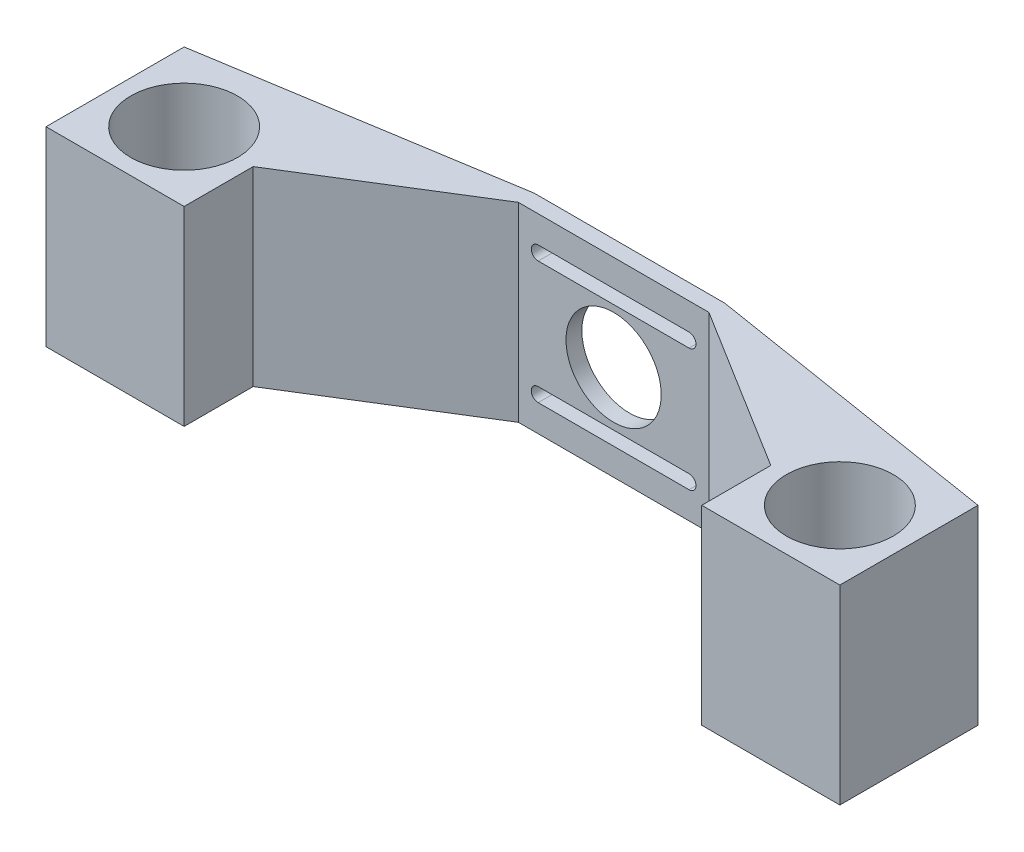
ISO-10303-21;
HEADER;
FILE_DESCRIPTION(('STEP AP214'),'2;1');
FILE_NAME('part.step','',(''),(''),'','','');
FILE_SCHEMA(('AUTOMOTIVE_DESIGN { 1 0 10303 214 1 1 1 1 }'));
ENDSEC;
DATA;
#1=APPLICATION_CONTEXT('core data for automotive mechanical design processes');
#2=APPLICATION_PROTOCOL_DEFINITION('international standard','automotive_design',2000,#1);
#3=PRODUCT_CONTEXT('',#1,'mechanical');
#4=PRODUCT('Part','Part','',(#3));
#5=PRODUCT_RELATED_PRODUCT_CATEGORY('part','',(#4));
#6=PRODUCT_DEFINITION_FORMATION('','',#4);
#7=PRODUCT_DEFINITION_CONTEXT('part definition',#1,'design');
#8=PRODUCT_DEFINITION('design','',#6,#7);
#9=PRODUCT_DEFINITION_SHAPE('','',#8);
#10=(LENGTH_UNIT() NAMED_UNIT(*) SI_UNIT(.MILLI.,.METRE.));
#11=(NAMED_UNIT(*) PLANE_ANGLE_UNIT() SI_UNIT($,.RADIAN.));
#12=(NAMED_UNIT(*) SI_UNIT($,.STERADIAN.) SOLID_ANGLE_UNIT());
#13=UNCERTAINTY_MEASURE_WITH_UNIT(LENGTH_MEASURE(1.E-05),#10,'distance_accuracy_value','');
#14=(GEOMETRIC_REPRESENTATION_CONTEXT(3) GLOBAL_UNCERTAINTY_ASSIGNED_CONTEXT((#13)) GLOBAL_UNIT_ASSIGNED_CONTEXT((#10,
#11,#12)) REPRESENTATION_CONTEXT('',''));
#15=CARTESIAN_POINT('',(0.,0.,0.));
#16=DIRECTION('',(0.,0.,1.));
#17=DIRECTION('',(1.,0.,0.));
#18=AXIS2_PLACEMENT_3D('',#15,#16,#17);
#19=CARTESIAN_POINT('',(0.,48.,0.));
#20=DIRECTION('',(0.,1.,0.));
#21=DIRECTION('',(0.,0.,1.));
#22=AXIS2_PLACEMENT_3D('',#19,#20,#21);
#23=PLANE('',#22);
#24=DIRECTION('',(0.,0.,1.));
#25=VECTOR('',#24,1.);
#26=CARTESIAN_POINT('',(-17.4,48.,17.4));
#27=LINE('',#26,#25);
#28=CARTESIAN_POINT('',(-17.4,48.,-17.4));
#29=VERTEX_POINT('',#28);
#30=CARTESIAN_POINT('',(-17.4,48.,17.4));
#31=VERTEX_POINT('',#30);
#32=EDGE_CURVE('E303',#29,#31,#27,.T.);
#33=ORIENTED_EDGE('',*,*,#32,.T.);
#34=DIRECTION('',(1.,0.,0.));
#35=VECTOR('',#34,1.);
#36=CARTESIAN_POINT('',(-17.4,48.,17.4));
#37=LINE('',#36,#35);
#38=CARTESIAN_POINT('',(17.4,48.,17.4));
#39=VERTEX_POINT('',#38);
#40=EDGE_CURVE('E306',#31,#39,#37,.T.);
#41=ORIENTED_EDGE('',*,*,#40,.T.);
#42=DIRECTION('',(0.,0.,-1.));
#43=VECTOR('',#42,1.);
#44=CARTESIAN_POINT('',(17.4,48.,17.4));
#45=LINE('',#44,#43);
#46=CARTESIAN_POINT('',(17.4,48.,0.));
#47=VERTEX_POINT('',#46);
#48=EDGE_CURVE('E309',#39,#47,#45,.T.);
#49=ORIENTED_EDGE('',*,*,#48,.T.);
#50=DIRECTION('',(0.849385240816697,0.,-0.527773353517171));
#51=VECTOR('',#50,1.);
#52=CARTESIAN_POINT('',(17.4,48.,0.));
#53=LINE('',#52,#51);
#54=CARTESIAN_POINT('',(58.6,48.,-25.6));
#55=VERTEX_POINT('',#54);
#56=EDGE_CURVE('E311',#47,#55,#53,.T.);
#57=ORIENTED_EDGE('',*,*,#56,.T.);
#58=DIRECTION('',(1.,0.,0.));
#59=VECTOR('',#58,1.);
#60=CARTESIAN_POINT('',(82.6,48.,-25.6));
#61=LINE('',#60,#59);
#62=CARTESIAN_POINT('',(106.6,48.,-25.6));
#63=VERTEX_POINT('',#62);
#64=EDGE_CURVE('E313',#55,#63,#61,.T.);
#65=ORIENTED_EDGE('',*,*,#64,.T.);
#66=DIRECTION('',(-0.849385240816697,0.,-0.527773353517171));
#67=VECTOR('',#66,1.);
#68=CARTESIAN_POINT('',(147.8,48.,0.));
#69=LINE('',#68,#67);
#70=CARTESIAN_POINT('',(147.8,48.,0.));
#71=VERTEX_POINT('',#70);
#72=EDGE_CURVE('E260',#71,#63,#69,.T.);
#73=ORIENTED_EDGE('',*,*,#72,.F.);
#74=DIRECTION('',(0.,0.,-1.));
#75=VECTOR('',#74,1.);
#76=CARTESIAN_POINT('',(147.8,48.,17.4));
#77=LINE('',#76,#75);
#78=CARTESIAN_POINT('',(147.8,48.,17.4));
#79=VERTEX_POINT('',#78);
#80=EDGE_CURVE('E263',#79,#71,#77,.T.);
#81=ORIENTED_EDGE('',*,*,#80,.F.);
#82=DIRECTION('',(-1.,0.,0.));
#83=VECTOR('',#82,1.);
#84=CARTESIAN_POINT('',(182.6,48.,17.4));
#85=LINE('',#84,#83);
#86=CARTESIAN_POINT('',(182.6,48.,17.4));
#87=VERTEX_POINT('',#86);
#88=EDGE_CURVE('E266',#87,#79,#85,.T.);
#89=ORIENTED_EDGE('',*,*,#88,.F.);
#90=DIRECTION('',(0.,0.,1.));
#91=VECTOR('',#90,1.);
#92=CARTESIAN_POINT('',(182.6,48.,17.4));
#93=LINE('',#92,#91);
#94=CARTESIAN_POINT('',(182.6,48.,-17.4));
#95=VERTEX_POINT('',#94);
#96=EDGE_CURVE('E253',#95,#87,#93,.T.);
#97=ORIENTED_EDGE('',*,*,#96,.F.);
#98=DIRECTION('',(0.98735943126704,0.,0.158497171861288));
#99=VECTOR('',#98,1.);
#100=CARTESIAN_POINT('',(106.6,48.,-29.6));
#101=LINE('',#100,#99);
#102=CARTESIAN_POINT('',(106.6,48.,-29.6));
#103=VERTEX_POINT('',#102);
#104=EDGE_CURVE('E256',#103,#95,#101,.T.);
#105=ORIENTED_EDGE('',*,*,#104,.F.);
#106=DIRECTION('',(-1.,0.,0.));
#107=VECTOR('',#106,1.);
#108=CARTESIAN_POINT('',(82.6,48.,-29.6));
#109=LINE('',#108,#107);
#110=CARTESIAN_POINT('',(58.6,48.,-29.6));
#111=VERTEX_POINT('',#110);
#112=EDGE_CURVE('E315',#103,#111,#109,.T.);
#113=ORIENTED_EDGE('',*,*,#112,.T.);
#114=DIRECTION('',(-0.98735943126704,0.,0.158497171861288));
#115=VECTOR('',#114,1.);
#116=CARTESIAN_POINT('',(58.6,48.,-29.6));
#117=LINE('',#116,#115);
#118=EDGE_CURVE('E317',#111,#29,#117,.T.);
#119=ORIENTED_EDGE('',*,*,#118,.T.);
#120=EDGE_LOOP('',(#33,#41,#49,#57,#65,#73,#81,#89,#97,#105,#113,#119));
#121=FACE_BOUND('',#120,.T.);
#122=CARTESIAN_POINT('',(0.,48.,0.));
#123=DIRECTION('',(0.,1.,0.));
#124=DIRECTION('',(0.,0.,1.));
#125=AXIS2_PLACEMENT_3D('',#122,#123,#124);
#126=CIRCLE('',#125,13.45);
#127=CARTESIAN_POINT('',(0.,48.,13.45));
#128=VERTEX_POINT('',#127);
#129=EDGE_CURVE('E297',#128,#128,#126,.T.);
#130=ORIENTED_EDGE('',*,*,#129,.F.);
#131=EDGE_LOOP('',(#130));
#132=FACE_BOUND('',#131,.T.);
#133=CARTESIAN_POINT('',(165.2,48.,0.));
#134=DIRECTION('',(0.,-1.,0.));
#135=DIRECTION('',(0.,0.,1.));
#136=AXIS2_PLACEMENT_3D('',#133,#134,#135);
#137=CIRCLE('',#136,13.45);
#138=CARTESIAN_POINT('',(165.2,48.,13.45));
#139=VERTEX_POINT('',#138);
#140=EDGE_CURVE('E247',#139,#139,#137,.T.);
#141=ORIENTED_EDGE('',*,*,#140,.T.);
#142=EDGE_LOOP('',(#141));
#143=FACE_BOUND('',#142,.T.);
#144=ADVANCED_FACE('F33',(#121,#132,#143),#23,.T.);
#145=CARTESIAN_POINT('',(0.,0.,0.));
#146=DIRECTION('',(0.,1.,0.));
#147=DIRECTION('',(0.,0.,1.));
#148=AXIS2_PLACEMENT_3D('',#145,#146,#147);
#149=PLANE('',#148);
#150=DIRECTION('',(0.,0.,1.));
#151=VECTOR('',#150,1.);
#152=CARTESIAN_POINT('',(-17.4,0.,17.4));
#153=LINE('',#152,#151);
#154=CARTESIAN_POINT('',(-17.4,0.,-17.4));
#155=VERTEX_POINT('',#154);
#156=CARTESIAN_POINT('',(-17.4,0.,17.4));
#157=VERTEX_POINT('',#156);
#158=EDGE_CURVE('E300',#155,#157,#153,.T.);
#159=ORIENTED_EDGE('',*,*,#158,.F.);
#160=DIRECTION('',(-0.98735943126704,0.,0.158497171861288));
#161=VECTOR('',#160,1.);
#162=CARTESIAN_POINT('',(58.6,0.,-29.6));
#163=LINE('',#162,#161);
#164=CARTESIAN_POINT('',(58.6,0.,-29.6));
#165=VERTEX_POINT('',#164);
#166=EDGE_CURVE('E307',#165,#155,#163,.T.);
#167=ORIENTED_EDGE('',*,*,#166,.F.);
#168=DIRECTION('',(-1.,0.,0.));
#169=VECTOR('',#168,1.);
#170=CARTESIAN_POINT('',(82.6,0.,-29.6));
#171=LINE('',#170,#169);
#172=CARTESIAN_POINT('',(106.6,0.,-29.6));
#173=VERTEX_POINT('',#172);
#174=EDGE_CURVE('E330',#173,#165,#171,.T.);
#175=ORIENTED_EDGE('',*,*,#174,.F.);
#176=DIRECTION('',(0.98735943126704,0.,0.158497171861288));
#177=VECTOR('',#176,1.);
#178=CARTESIAN_POINT('',(106.6,0.,-29.6));
#179=LINE('',#178,#177);
#180=CARTESIAN_POINT('',(182.6,0.,-17.4));
#181=VERTEX_POINT('',#180);
#182=EDGE_CURVE('E272',#173,#181,#179,.T.);
#183=ORIENTED_EDGE('',*,*,#182,.T.);
#184=DIRECTION('',(0.,0.,1.));
#185=VECTOR('',#184,1.);
#186=CARTESIAN_POINT('',(182.6,0.,17.4));
#187=LINE('',#186,#185);
#188=CARTESIAN_POINT('',(182.6,0.,17.4));
#189=VERTEX_POINT('',#188);
#190=EDGE_CURVE('E250',#181,#189,#187,.T.);
#191=ORIENTED_EDGE('',*,*,#190,.T.);
#192=DIRECTION('',(-1.,0.,0.));
#193=VECTOR('',#192,1.);
#194=CARTESIAN_POINT('',(182.6,0.,17.4));
#195=LINE('',#194,#193);
#196=CARTESIAN_POINT('',(147.8,0.,17.4));
#197=VERTEX_POINT('',#196);
#198=EDGE_CURVE('E257',#189,#197,#195,.T.);
#199=ORIENTED_EDGE('',*,*,#198,.T.);
#200=DIRECTION('',(0.,0.,-1.));
#201=VECTOR('',#200,1.);
#202=CARTESIAN_POINT('',(147.8,0.,17.4));
#203=LINE('',#202,#201);
#204=CARTESIAN_POINT('',(147.8,0.,0.));
#205=VERTEX_POINT('',#204);
#206=EDGE_CURVE('E278',#197,#205,#203,.T.);
#207=ORIENTED_EDGE('',*,*,#206,.T.);
#208=DIRECTION('',(-0.849385240816697,0.,-0.527773353517171));
#209=VECTOR('',#208,1.);
#210=CARTESIAN_POINT('',(147.8,0.,0.));
#211=LINE('',#210,#209);
#212=CARTESIAN_POINT('',(106.6,0.,-25.6));
#213=VERTEX_POINT('',#212);
#214=EDGE_CURVE('E275',#205,#213,#211,.T.);
#215=ORIENTED_EDGE('',*,*,#214,.T.);
#216=DIRECTION('',(1.,0.,0.));
#217=VECTOR('',#216,1.);
#218=CARTESIAN_POINT('',(82.6,0.,-25.6));
#219=LINE('',#218,#217);
#220=CARTESIAN_POINT('',(58.6,0.,-25.6));
#221=VERTEX_POINT('',#220);
#222=EDGE_CURVE('E328',#221,#213,#219,.T.);
#223=ORIENTED_EDGE('',*,*,#222,.F.);
#224=DIRECTION('',(0.849385240816697,0.,-0.527773353517171));
#225=VECTOR('',#224,1.);
#226=CARTESIAN_POINT('',(17.4,0.,0.));
#227=LINE('',#226,#225);
#228=CARTESIAN_POINT('',(17.4,0.,0.));
#229=VERTEX_POINT('',#228);
#230=EDGE_CURVE('E326',#229,#221,#227,.T.);
#231=ORIENTED_EDGE('',*,*,#230,.F.);
#232=DIRECTION('',(0.,0.,-1.));
#233=VECTOR('',#232,1.);
#234=CARTESIAN_POINT('',(17.4,0.,17.4));
#235=LINE('',#234,#233);
#236=CARTESIAN_POINT('',(17.4,0.,17.4));
#237=VERTEX_POINT('',#236);
#238=EDGE_CURVE('E324',#237,#229,#235,.T.);
#239=ORIENTED_EDGE('',*,*,#238,.F.);
#240=DIRECTION('',(1.,0.,0.));
#241=VECTOR('',#240,1.);
#242=CARTESIAN_POINT('',(-17.4,0.,17.4));
#243=LINE('',#242,#241);
#244=EDGE_CURVE('E322',#157,#237,#243,.T.);
#245=ORIENTED_EDGE('',*,*,#244,.F.);
#246=EDGE_LOOP('',(#159,#167,#175,#183,#191,#199,#207,#215,#223,#231,#239,#245));
#247=FACE_BOUND('',#246,.T.);
#248=CARTESIAN_POINT('',(0.,0.,0.));
#249=DIRECTION('',(0.,1.,0.));
#250=DIRECTION('',(0.,0.,1.));
#251=AXIS2_PLACEMENT_3D('',#248,#249,#250);
#252=CIRCLE('',#251,13.45);
#253=CARTESIAN_POINT('',(0.,0.,13.45));
#254=VERTEX_POINT('',#253);
#255=EDGE_CURVE('E296',#254,#254,#252,.T.);
#256=ORIENTED_EDGE('',*,*,#255,.T.);
#257=EDGE_LOOP('',(#256));
#258=FACE_BOUND('',#257,.T.);
#259=CARTESIAN_POINT('',(165.2,0.,0.));
#260=DIRECTION('',(0.,-1.,0.));
#261=DIRECTION('',(0.,0.,1.));
#262=AXIS2_PLACEMENT_3D('',#259,#260,#261);
#263=CIRCLE('',#262,13.45);
#264=CARTESIAN_POINT('',(165.2,0.,13.45));
#265=VERTEX_POINT('',#264);
#266=EDGE_CURVE('E246',#265,#265,#263,.T.);
#267=ORIENTED_EDGE('',*,*,#266,.F.);
#268=EDGE_LOOP('',(#267));
#269=FACE_BOUND('',#268,.T.);
#270=ADVANCED_FACE('F354',(#247,#258,#269),#149,.F.);
#271=CARTESIAN_POINT('',(-17.4,48.,17.4));
#272=DIRECTION('',(1.,0.,0.));
#273=DIRECTION('',(0.,0.,-1.));
#274=AXIS2_PLACEMENT_3D('',#271,#272,#273);
#275=PLANE('',#274);
#276=ORIENTED_EDGE('',*,*,#158,.T.);
#277=DIRECTION('',(0.,-1.,0.));
#278=VECTOR('',#277,1.);
#279=CARTESIAN_POINT('',(-17.4,48.,17.4));
#280=LINE('',#279,#278);
#281=EDGE_CURVE('E11',#31,#157,#280,.T.);
#282=ORIENTED_EDGE('',*,*,#281,.F.);
#283=ORIENTED_EDGE('',*,*,#32,.F.);
#284=DIRECTION('',(0.,-1.,0.));
#285=VECTOR('',#284,1.);
#286=CARTESIAN_POINT('',(-17.4,48.,-17.4));
#287=LINE('',#286,#285);
#288=EDGE_CURVE('E319',#29,#155,#287,.T.);
#289=ORIENTED_EDGE('',*,*,#288,.T.);
#290=EDGE_LOOP('',(#276,#282,#283,#289));
#291=FACE_BOUND('',#290,.T.);
#292=ADVANCED_FACE('F35',(#291),#275,.F.);
#293=CARTESIAN_POINT('',(-17.4,48.,17.4));
#294=DIRECTION('',(0.,0.,-1.));
#295=DIRECTION('',(-1.,0.,0.));
#296=AXIS2_PLACEMENT_3D('',#293,#294,#295);
#297=PLANE('',#296);
#298=ORIENTED_EDGE('',*,*,#244,.T.);
#299=DIRECTION('',(0.,-1.,0.));
#300=VECTOR('',#299,1.);
#301=CARTESIAN_POINT('',(17.4,48.,17.4));
#302=LINE('',#301,#300);
#303=EDGE_CURVE('E41',#39,#237,#302,.T.);
#304=ORIENTED_EDGE('',*,*,#303,.F.);
#305=ORIENTED_EDGE('',*,*,#40,.F.);
#306=ORIENTED_EDGE('',*,*,#281,.T.);
#307=EDGE_LOOP('',(#298,#304,#305,#306));
#308=FACE_BOUND('',#307,.T.);
#309=ADVANCED_FACE('F371',(#308),#297,.F.);
#310=CARTESIAN_POINT('',(17.4,48.,17.4));
#311=DIRECTION('',(-1.,0.,0.));
#312=DIRECTION('',(0.,0.,1.));
#313=AXIS2_PLACEMENT_3D('',#310,#311,#312);
#314=PLANE('',#313);
#315=ORIENTED_EDGE('',*,*,#238,.T.);
#316=DIRECTION('',(0.,-1.,0.));
#317=VECTOR('',#316,1.);
#318=CARTESIAN_POINT('',(17.4,48.,0.));
#319=LINE('',#318,#317);
#320=EDGE_CURVE('E341',#47,#229,#319,.T.);
#321=ORIENTED_EDGE('',*,*,#320,.F.);
#322=ORIENTED_EDGE('',*,*,#48,.F.);
#323=ORIENTED_EDGE('',*,*,#303,.T.);
#324=EDGE_LOOP('',(#315,#321,#322,#323));
#325=FACE_BOUND('',#324,.T.);
#326=ADVANCED_FACE('F348',(#325),#314,.F.);
#327=CARTESIAN_POINT('',(17.4,48.,0.));
#328=DIRECTION('',(-0.527773353517171,0.,-0.849385240816697));
#329=DIRECTION('',(-0.849385240816697,0.,0.527773353517171));
#330=AXIS2_PLACEMENT_3D('',#327,#328,#329);
#331=PLANE('',#330);
#332=ORIENTED_EDGE('',*,*,#230,.T.);
#333=DIRECTION('',(0.,-1.,0.));
#334=VECTOR('',#333,1.);
#335=CARTESIAN_POINT('',(58.6,48.,-25.6));
#336=LINE('',#335,#334);
#337=EDGE_CURVE('E338',#55,#221,#336,.T.);
#338=ORIENTED_EDGE('',*,*,#337,.F.);
#339=ORIENTED_EDGE('',*,*,#56,.F.);
#340=ORIENTED_EDGE('',*,*,#320,.T.);
#341=EDGE_LOOP('',(#332,#338,#339,#340));
#342=FACE_BOUND('',#341,.T.);
#343=ADVANCED_FACE('F359',(#342),#331,.F.);
#344=CARTESIAN_POINT('',(82.6,48.,-25.6));
#345=DIRECTION('',(0.,0.,-1.));
#346=DIRECTION('',(-1.,0.,0.));
#347=AXIS2_PLACEMENT_3D('',#344,#345,#346);
#348=PLANE('',#347);
#349=DIRECTION('',(1.,0.,0.));
#350=VECTOR('',#349,1.);
#351=CARTESIAN_POINT('',(82.6,10.3,-25.6));
#352=LINE('',#351,#350);
#353=CARTESIAN_POINT('',(63.6,10.3,-25.6));
#354=VERTEX_POINT('',#353);
#355=CARTESIAN_POINT('',(101.6,10.3,-25.6));
#356=VERTEX_POINT('',#355);
#357=EDGE_CURVE('E240',#354,#356,#352,.T.);
#358=ORIENTED_EDGE('',*,*,#357,.T.);
#359=CARTESIAN_POINT('',(101.6,8.55,-25.6));
#360=DIRECTION('',(0.,0.,-1.));
#361=DIRECTION('',(-1.,0.,0.));
#362=AXIS2_PLACEMENT_3D('',#359,#360,#361);
#363=CIRCLE('',#362,1.75);
#364=CARTESIAN_POINT('',(101.6,6.8,-25.6));
#365=VERTEX_POINT('',#364);
#366=EDGE_CURVE('E243',#356,#365,#363,.T.);
#367=ORIENTED_EDGE('',*,*,#366,.T.);
#368=DIRECTION('',(-1.,0.,0.));
#369=VECTOR('',#368,1.);
#370=CARTESIAN_POINT('',(82.6,6.80000000000001,-25.6));
#371=LINE('',#370,#369);
#372=CARTESIAN_POINT('',(63.6,6.80000000000001,-25.6));
#373=VERTEX_POINT('',#372);
#374=EDGE_CURVE('E237',#365,#373,#371,.T.);
#375=ORIENTED_EDGE('',*,*,#374,.T.);
#376=CARTESIAN_POINT('',(63.6,8.55000000000001,-25.6));
#377=DIRECTION('',(0.,0.,-1.));
#378=DIRECTION('',(-1.,0.,0.));
#379=AXIS2_PLACEMENT_3D('',#376,#377,#378);
#380=CIRCLE('',#379,1.75);
#381=EDGE_CURVE('E175',#373,#354,#380,.T.);
#382=ORIENTED_EDGE('',*,*,#381,.T.);
#383=EDGE_LOOP('',(#358,#367,#375,#382));
#384=FACE_BOUND('',#383,.T.);
#385=DIRECTION('',(1.,0.,0.));
#386=VECTOR('',#385,1.);
#387=CARTESIAN_POINT('',(82.6,41.2,-25.6));
#388=LINE('',#387,#386);
#389=CARTESIAN_POINT('',(63.6,41.2,-25.6));
#390=VERTEX_POINT('',#389);
#391=CARTESIAN_POINT('',(101.6,41.2,-25.6));
#392=VERTEX_POINT('',#391);
#393=EDGE_CURVE('E231',#390,#392,#388,.T.);
#394=ORIENTED_EDGE('',*,*,#393,.T.);
#395=CARTESIAN_POINT('',(101.6,39.45,-25.6));
#396=DIRECTION('',(0.,0.,-1.));
#397=DIRECTION('',(-1.,0.,0.));
#398=AXIS2_PLACEMENT_3D('',#395,#396,#397);
#399=CIRCLE('',#398,1.75);
#400=CARTESIAN_POINT('',(101.6,37.7,-25.6));
#401=VERTEX_POINT('',#400);
#402=EDGE_CURVE('E234',#392,#401,#399,.T.);
#403=ORIENTED_EDGE('',*,*,#402,.T.);
#404=DIRECTION('',(-1.,0.,0.));
#405=VECTOR('',#404,1.);
#406=CARTESIAN_POINT('',(82.6,37.7,-25.6));
#407=LINE('',#406,#405);
#408=CARTESIAN_POINT('',(63.6,37.7,-25.6));
#409=VERTEX_POINT('',#408);
#410=EDGE_CURVE('E225',#401,#409,#407,.T.);
#411=ORIENTED_EDGE('',*,*,#410,.T.);
#412=CARTESIAN_POINT('',(63.6,39.45,-25.6));
#413=DIRECTION('',(0.,0.,-1.));
#414=DIRECTION('',(-1.,0.,0.));
#415=AXIS2_PLACEMENT_3D('',#412,#413,#414);
#416=CIRCLE('',#415,1.75);
#417=EDGE_CURVE('E228',#409,#390,#416,.T.);
#418=ORIENTED_EDGE('',*,*,#417,.T.);
#419=EDGE_LOOP('',(#394,#403,#411,#418));
#420=FACE_BOUND('',#419,.T.);
#421=CARTESIAN_POINT('',(82.6,24.,-25.6));
#422=DIRECTION('',(0.,0.,-1.));
#423=DIRECTION('',(-1.,0.,0.));
#424=AXIS2_PLACEMENT_3D('',#421,#422,#423);
#425=CIRCLE('',#424,12.);
#426=CARTESIAN_POINT('',(70.6,24.,-25.6));
#427=VERTEX_POINT('',#426);
#428=EDGE_CURVE('E199',#427,#427,#425,.T.);
#429=ORIENTED_EDGE('',*,*,#428,.T.);
#430=EDGE_LOOP('',(#429));
#431=FACE_BOUND('',#430,.T.);
#432=ORIENTED_EDGE('',*,*,#222,.T.);
#433=DIRECTION('',(0.,-1.,0.));
#434=VECTOR('',#433,1.);
#435=CARTESIAN_POINT('',(106.6,48.,-25.6));
#436=LINE('',#435,#434);
#437=EDGE_CURVE('E288',#63,#213,#436,.T.);
#438=ORIENTED_EDGE('',*,*,#437,.F.);
#439=ORIENTED_EDGE('',*,*,#64,.F.);
#440=ORIENTED_EDGE('',*,*,#337,.T.);
#441=EDGE_LOOP('',(#432,#438,#439,#440));
#442=FACE_BOUND('',#441,.T.);
#443=ADVANCED_FACE('F363',(#384,#420,#431,#442),#348,.F.);
#444=CARTESIAN_POINT('',(82.6,48.,-29.6));
#445=DIRECTION('',(0.,0.,1.));
#446=DIRECTION('',(1.,0.,0.));
#447=AXIS2_PLACEMENT_3D('',#444,#445,#446);
#448=PLANE('',#447);
#449=DIRECTION('',(-1.,0.,0.));
#450=VECTOR('',#449,1.);
#451=CARTESIAN_POINT('',(101.6,6.8,-29.6));
#452=LINE('',#451,#450);
#453=CARTESIAN_POINT('',(101.6,6.8,-29.6));
#454=VERTEX_POINT('',#453);
#455=CARTESIAN_POINT('',(63.6,6.80000000000001,-29.6));
#456=VERTEX_POINT('',#455);
#457=EDGE_CURVE('E182',#454,#456,#452,.T.);
#458=ORIENTED_EDGE('',*,*,#457,.F.);
#459=CARTESIAN_POINT('',(101.6,8.55,-29.6));
#460=DIRECTION('',(0.,0.,-1.));
#461=DIRECTION('',(-1.,0.,0.));
#462=AXIS2_PLACEMENT_3D('',#459,#460,#461);
#463=CIRCLE('',#462,1.75);
#464=CARTESIAN_POINT('',(101.6,10.3,-29.6));
#465=VERTEX_POINT('',#464);
#466=EDGE_CURVE('E187',#465,#454,#463,.T.);
#467=ORIENTED_EDGE('',*,*,#466,.F.);
#468=DIRECTION('',(1.,0.,0.));
#469=VECTOR('',#468,1.);
#470=CARTESIAN_POINT('',(101.6,10.3,-29.6));
#471=LINE('',#470,#469);
#472=CARTESIAN_POINT('',(63.6,10.3,-29.6));
#473=VERTEX_POINT('',#472);
#474=EDGE_CURVE('E192',#473,#465,#471,.T.);
#475=ORIENTED_EDGE('',*,*,#474,.F.);
#476=CARTESIAN_POINT('',(63.6,8.55000000000001,-29.6));
#477=DIRECTION('',(0.,0.,-1.));
#478=DIRECTION('',(-1.,0.,0.));
#479=AXIS2_PLACEMENT_3D('',#476,#477,#478);
#480=CIRCLE('',#479,1.75);
#481=EDGE_CURVE('E172',#456,#473,#480,.T.);
#482=ORIENTED_EDGE('',*,*,#481,.F.);
#483=EDGE_LOOP('',(#458,#467,#475,#482));
#484=FACE_BOUND('',#483,.T.);
#485=DIRECTION('',(-1.,0.,0.));
#486=VECTOR('',#485,1.);
#487=CARTESIAN_POINT('',(101.6,37.7,-29.6));
#488=LINE('',#487,#486);
#489=CARTESIAN_POINT('',(101.6,37.7,-29.6));
#490=VERTEX_POINT('',#489);
#491=CARTESIAN_POINT('',(63.6,37.7,-29.6));
#492=VERTEX_POINT('',#491);
#493=EDGE_CURVE('E204',#490,#492,#488,.T.);
#494=ORIENTED_EDGE('',*,*,#493,.F.);
#495=CARTESIAN_POINT('',(101.6,39.45,-29.6));
#496=DIRECTION('',(0.,0.,-1.));
#497=DIRECTION('',(1.,0.,0.));
#498=AXIS2_PLACEMENT_3D('',#495,#496,#497);
#499=CIRCLE('',#498,1.75);
#500=CARTESIAN_POINT('',(101.6,41.2,-29.6));
#501=VERTEX_POINT('',#500);
#502=EDGE_CURVE('E202',#501,#490,#499,.T.);
#503=ORIENTED_EDGE('',*,*,#502,.F.);
#504=DIRECTION('',(1.,0.,0.));
#505=VECTOR('',#504,1.);
#506=CARTESIAN_POINT('',(101.6,41.2,-29.6));
#507=LINE('',#506,#505);
#508=CARTESIAN_POINT('',(63.6,41.2,-29.6));
#509=VERTEX_POINT('',#508);
#510=EDGE_CURVE('E210',#509,#501,#507,.T.);
#511=ORIENTED_EDGE('',*,*,#510,.F.);
#512=CARTESIAN_POINT('',(63.6,39.45,-29.6));
#513=DIRECTION('',(0.,0.,-1.));
#514=DIRECTION('',(1.,0.,0.));
#515=AXIS2_PLACEMENT_3D('',#512,#513,#514);
#516=CIRCLE('',#515,1.75);
#517=EDGE_CURVE('E207',#492,#509,#516,.T.);
#518=ORIENTED_EDGE('',*,*,#517,.F.);
#519=EDGE_LOOP('',(#494,#503,#511,#518));
#520=FACE_BOUND('',#519,.T.);
#521=CARTESIAN_POINT('',(82.6,24.,-29.6));
#522=DIRECTION('',(0.,0.,-1.));
#523=DIRECTION('',(-1.,0.,0.));
#524=AXIS2_PLACEMENT_3D('',#521,#522,#523);
#525=CIRCLE('',#524,12.);
#526=CARTESIAN_POINT('',(70.6,24.,-29.6));
#527=VERTEX_POINT('',#526);
#528=EDGE_CURVE('E205',#527,#527,#525,.T.);
#529=ORIENTED_EDGE('',*,*,#528,.F.);
#530=EDGE_LOOP('',(#529));
#531=FACE_BOUND('',#530,.T.);
#532=ORIENTED_EDGE('',*,*,#174,.T.);
#533=DIRECTION('',(0.,-1.,0.));
#534=VECTOR('',#533,1.);
#535=CARTESIAN_POINT('',(58.6,48.,-29.6));
#536=LINE('',#535,#534);
#537=EDGE_CURVE('E335',#111,#165,#536,.T.);
#538=ORIENTED_EDGE('',*,*,#537,.F.);
#539=ORIENTED_EDGE('',*,*,#112,.F.);
#540=DIRECTION('',(0.,-1.,0.));
#541=VECTOR('',#540,1.);
#542=CARTESIAN_POINT('',(106.6,48.,-29.6));
#543=LINE('',#542,#541);
#544=EDGE_CURVE('E291',#103,#173,#543,.T.);
#545=ORIENTED_EDGE('',*,*,#544,.T.);
#546=EDGE_LOOP('',(#532,#538,#539,#545));
#547=FACE_BOUND('',#546,.T.);
#548=ADVANCED_FACE('F189',(#484,#520,#531,#547),#448,.F.);
#549=CARTESIAN_POINT('',(58.6,48.,-29.6));
#550=DIRECTION('',(0.158497171861288,0.,0.98735943126704));
#551=DIRECTION('',(0.987359431267041,0.,-0.158497171861288));
#552=AXIS2_PLACEMENT_3D('',#549,#550,#551);
#553=PLANE('',#552);
#554=ORIENTED_EDGE('',*,*,#166,.T.);
#555=ORIENTED_EDGE('',*,*,#288,.F.);
#556=ORIENTED_EDGE('',*,*,#118,.F.);
#557=ORIENTED_EDGE('',*,*,#537,.T.);
#558=EDGE_LOOP('',(#554,#555,#556,#557));
#559=FACE_BOUND('',#558,.T.);
#560=ADVANCED_FACE('F376',(#559),#553,.F.);
#561=CARTESIAN_POINT('',(0.,48.,0.));
#562=DIRECTION('',(0.,-1.,0.));
#563=DIRECTION('',(0.,0.,-1.));
#564=AXIS2_PLACEMENT_3D('',#561,#562,#563);
#565=CYLINDRICAL_SURFACE('',#564,13.45);
#566=ORIENTED_EDGE('',*,*,#129,.T.);
#567=EDGE_LOOP('',(#566));
#568=FACE_BOUND('',#567,.T.);
#569=ORIENTED_EDGE('',*,*,#255,.F.);
#570=EDGE_LOOP('',(#569));
#571=FACE_BOUND('',#570,.T.);
#572=ADVANCED_FACE('F413',(#568,#571),#565,.F.);
#573=CARTESIAN_POINT('',(182.6,48.,17.4));
#574=DIRECTION('',(1.,0.,0.));
#575=DIRECTION('',(0.,0.,-1.));
#576=AXIS2_PLACEMENT_3D('',#573,#574,#575);
#577=PLANE('',#576);
#578=ORIENTED_EDGE('',*,*,#190,.F.);
#579=DIRECTION('',(0.,-1.,0.));
#580=VECTOR('',#579,1.);
#581=CARTESIAN_POINT('',(182.6,48.,-17.4));
#582=LINE('',#581,#580);
#583=EDGE_CURVE('E294',#95,#181,#582,.T.);
#584=ORIENTED_EDGE('',*,*,#583,.F.);
#585=ORIENTED_EDGE('',*,*,#96,.T.);
#586=DIRECTION('',(0.,-1.,0.));
#587=VECTOR('',#586,1.);
#588=CARTESIAN_POINT('',(182.6,48.,17.4));
#589=LINE('',#588,#587);
#590=EDGE_CURVE('E269',#87,#189,#589,.T.);
#591=ORIENTED_EDGE('',*,*,#590,.T.);
#592=EDGE_LOOP('',(#578,#584,#585,#591));
#593=FACE_BOUND('',#592,.T.);
#594=ADVANCED_FACE('F404',(#593),#577,.T.);
#595=CARTESIAN_POINT('',(106.6,48.,-29.6));
#596=DIRECTION('',(0.158497171861288,0.,-0.98735943126704));
#597=DIRECTION('',(-0.987359431267041,0.,-0.158497171861288));
#598=AXIS2_PLACEMENT_3D('',#595,#596,#597);
#599=PLANE('',#598);
#600=ORIENTED_EDGE('',*,*,#182,.F.);
#601=ORIENTED_EDGE('',*,*,#544,.F.);
#602=ORIENTED_EDGE('',*,*,#104,.T.);
#603=ORIENTED_EDGE('',*,*,#583,.T.);
#604=EDGE_LOOP('',(#600,#601,#602,#603));
#605=FACE_BOUND('',#604,.T.);
#606=ADVANCED_FACE('F384',(#605),#599,.T.);
#607=CARTESIAN_POINT('',(147.8,48.,0.));
#608=DIRECTION('',(-0.527773353517171,0.,0.849385240816697));
#609=DIRECTION('',(0.849385240816697,0.,0.527773353517171));
#610=AXIS2_PLACEMENT_3D('',#607,#608,#609);
#611=PLANE('',#610);
#612=ORIENTED_EDGE('',*,*,#214,.F.);
#613=DIRECTION('',(0.,-1.,0.));
#614=VECTOR('',#613,1.);
#615=CARTESIAN_POINT('',(147.8,48.,0.));
#616=LINE('',#615,#614);
#617=EDGE_CURVE('E286',#71,#205,#616,.T.);
#618=ORIENTED_EDGE('',*,*,#617,.F.);
#619=ORIENTED_EDGE('',*,*,#72,.T.);
#620=ORIENTED_EDGE('',*,*,#437,.T.);
#621=EDGE_LOOP('',(#612,#618,#619,#620));
#622=FACE_BOUND('',#621,.T.);
#623=ADVANCED_FACE('F396',(#622),#611,.T.);
#624=CARTESIAN_POINT('',(147.8,48.,17.4));
#625=DIRECTION('',(-1.,0.,0.));
#626=DIRECTION('',(0.,0.,1.));
#627=AXIS2_PLACEMENT_3D('',#624,#625,#626);
#628=PLANE('',#627);
#629=ORIENTED_EDGE('',*,*,#206,.F.);
#630=DIRECTION('',(0.,-1.,0.));
#631=VECTOR('',#630,1.);
#632=CARTESIAN_POINT('',(147.8,48.,17.4));
#633=LINE('',#632,#631);
#634=EDGE_CURVE('E284',#79,#197,#633,.T.);
#635=ORIENTED_EDGE('',*,*,#634,.F.);
#636=ORIENTED_EDGE('',*,*,#80,.T.);
#637=ORIENTED_EDGE('',*,*,#617,.T.);
#638=EDGE_LOOP('',(#629,#635,#636,#637));
#639=FACE_BOUND('',#638,.T.);
#640=ADVANCED_FACE('F393',(#639),#628,.T.);
#641=CARTESIAN_POINT('',(182.6,48.,17.4));
#642=DIRECTION('',(0.,0.,1.));
#643=DIRECTION('',(1.,0.,0.));
#644=AXIS2_PLACEMENT_3D('',#641,#642,#643);
#645=PLANE('',#644);
#646=ORIENTED_EDGE('',*,*,#198,.F.);
#647=ORIENTED_EDGE('',*,*,#590,.F.);
#648=ORIENTED_EDGE('',*,*,#88,.T.);
#649=ORIENTED_EDGE('',*,*,#634,.T.);
#650=EDGE_LOOP('',(#646,#647,#648,#649));
#651=FACE_BOUND('',#650,.T.);
#652=ADVANCED_FACE('F389',(#651),#645,.T.);
#653=CARTESIAN_POINT('',(165.2,48.,0.));
#654=DIRECTION('',(0.,-1.,0.));
#655=DIRECTION('',(0.,0.,-1.));
#656=AXIS2_PLACEMENT_3D('',#653,#654,#655);
#657=CYLINDRICAL_SURFACE('',#656,13.45);
#658=ORIENTED_EDGE('',*,*,#140,.F.);
#659=EDGE_LOOP('',(#658));
#660=FACE_BOUND('',#659,.T.);
#661=ORIENTED_EDGE('',*,*,#266,.T.);
#662=EDGE_LOOP('',(#661));
#663=FACE_BOUND('',#662,.T.);
#664=ADVANCED_FACE('F475',(#660,#663),#657,.F.);
#665=CARTESIAN_POINT('',(82.6,24.,18.4));
#666=DIRECTION('',(0.,0.,-1.));
#667=DIRECTION('',(-1.,0.,0.));
#668=AXIS2_PLACEMENT_3D('',#665,#666,#667);
#669=CYLINDRICAL_SURFACE('',#668,12.);
#670=ORIENTED_EDGE('',*,*,#528,.T.);
#671=EDGE_LOOP('',(#670));
#672=FACE_BOUND('',#671,.T.);
#673=ORIENTED_EDGE('',*,*,#428,.F.);
#674=EDGE_LOOP('',(#673));
#675=FACE_BOUND('',#674,.T.);
#676=ADVANCED_FACE('F484',(#672,#675),#669,.F.);
#677=CARTESIAN_POINT('',(101.6,39.45,18.4));
#678=DIRECTION('',(0.,0.,-1.));
#679=DIRECTION('',(-1.,0.,0.));
#680=AXIS2_PLACEMENT_3D('',#677,#678,#679);
#681=CYLINDRICAL_SURFACE('',#680,1.75);
#682=DIRECTION('',(0.,0.,-1.));
#683=VECTOR('',#682,1.);
#684=CARTESIAN_POINT('',(101.6,41.2,18.4));
#685=LINE('',#684,#683);
#686=EDGE_CURVE('E214',#392,#501,#685,.T.);
#687=ORIENTED_EDGE('',*,*,#686,.T.);
#688=ORIENTED_EDGE('',*,*,#502,.T.);
#689=DIRECTION('',(0.,0.,-1.));
#690=VECTOR('',#689,1.);
#691=CARTESIAN_POINT('',(101.6,37.7,18.4));
#692=LINE('',#691,#690);
#693=EDGE_CURVE('E213',#401,#490,#692,.T.);
#694=ORIENTED_EDGE('',*,*,#693,.F.);
#695=ORIENTED_EDGE('',*,*,#402,.F.);
#696=EDGE_LOOP('',(#687,#688,#694,#695));
#697=FACE_BOUND('',#696,.T.);
#698=ADVANCED_FACE('F506',(#697),#681,.F.);
#699=CARTESIAN_POINT('',(101.6,41.2,18.4));
#700=DIRECTION('',(0.,1.,0.));
#701=DIRECTION('',(-1.,0.,0.));
#702=AXIS2_PLACEMENT_3D('',#699,#700,#701);
#703=PLANE('',#702);
#704=DIRECTION('',(0.,0.,-1.));
#705=VECTOR('',#704,1.);
#706=CARTESIAN_POINT('',(63.6,41.2,18.4));
#707=LINE('',#706,#705);
#708=EDGE_CURVE('E216',#390,#509,#707,.T.);
#709=ORIENTED_EDGE('',*,*,#708,.T.);
#710=ORIENTED_EDGE('',*,*,#510,.T.);
#711=ORIENTED_EDGE('',*,*,#686,.F.);
#712=ORIENTED_EDGE('',*,*,#393,.F.);
#713=EDGE_LOOP('',(#709,#710,#711,#712));
#714=FACE_BOUND('',#713,.T.);
#715=ADVANCED_FACE('F516',(#714),#703,.F.);
#716=CARTESIAN_POINT('',(63.6,39.45,18.4));
#717=DIRECTION('',(0.,0.,-1.));
#718=DIRECTION('',(-1.,0.,0.));
#719=AXIS2_PLACEMENT_3D('',#716,#717,#718);
#720=CYLINDRICAL_SURFACE('',#719,1.75);
#721=DIRECTION('',(0.,0.,-1.));
#722=VECTOR('',#721,1.);
#723=CARTESIAN_POINT('',(63.6,37.7,18.4));
#724=LINE('',#723,#722);
#725=EDGE_CURVE('E56',#409,#492,#724,.T.);
#726=ORIENTED_EDGE('',*,*,#725,.T.);
#727=ORIENTED_EDGE('',*,*,#517,.T.);
#728=ORIENTED_EDGE('',*,*,#708,.F.);
#729=ORIENTED_EDGE('',*,*,#417,.F.);
#730=EDGE_LOOP('',(#726,#727,#728,#729));
#731=FACE_BOUND('',#730,.T.);
#732=ADVANCED_FACE('F526',(#731),#720,.F.);
#733=CARTESIAN_POINT('',(101.6,37.7,18.4));
#734=DIRECTION('',(0.,-1.,0.));
#735=DIRECTION('',(1.,0.,0.));
#736=AXIS2_PLACEMENT_3D('',#733,#734,#735);
#737=PLANE('',#736);
#738=ORIENTED_EDGE('',*,*,#693,.T.);
#739=ORIENTED_EDGE('',*,*,#493,.T.);
#740=ORIENTED_EDGE('',*,*,#725,.F.);
#741=ORIENTED_EDGE('',*,*,#410,.F.);
#742=EDGE_LOOP('',(#738,#739,#740,#741));
#743=FACE_BOUND('',#742,.T.);
#744=ADVANCED_FACE('F536',(#743),#737,.F.);
#745=CARTESIAN_POINT('',(101.6,8.55,18.4));
#746=DIRECTION('',(0.,0.,-1.));
#747=DIRECTION('',(-1.,0.,0.));
#748=AXIS2_PLACEMENT_3D('',#745,#746,#747);
#749=CYLINDRICAL_SURFACE('',#748,1.75);
#750=DIRECTION('',(0.,0.,-1.));
#751=VECTOR('',#750,1.);
#752=CARTESIAN_POINT('',(101.6,10.3,18.4));
#753=LINE('',#752,#751);
#754=EDGE_CURVE('E197',#356,#465,#753,.T.);
#755=ORIENTED_EDGE('',*,*,#754,.T.);
#756=ORIENTED_EDGE('',*,*,#466,.T.);
#757=DIRECTION('',(0.,0.,-1.));
#758=VECTOR('',#757,1.);
#759=CARTESIAN_POINT('',(101.6,6.8,18.4));
#760=LINE('',#759,#758);
#761=EDGE_CURVE('E178',#365,#454,#760,.T.);
#762=ORIENTED_EDGE('',*,*,#761,.F.);
#763=ORIENTED_EDGE('',*,*,#366,.F.);
#764=EDGE_LOOP('',(#755,#756,#762,#763));
#765=FACE_BOUND('',#764,.T.);
#766=ADVANCED_FACE('F546',(#765),#749,.F.);
#767=CARTESIAN_POINT('',(101.6,10.3,18.4));
#768=DIRECTION('',(0.,1.,0.));
#769=DIRECTION('',(-1.,0.,0.));
#770=AXIS2_PLACEMENT_3D('',#767,#768,#769);
#771=PLANE('',#770);
#772=DIRECTION('',(0.,0.,-1.));
#773=VECTOR('',#772,1.);
#774=CARTESIAN_POINT('',(63.6,10.3,18.4));
#775=LINE('',#774,#773);
#776=EDGE_CURVE('E177',#354,#473,#775,.T.);
#777=ORIENTED_EDGE('',*,*,#776,.T.);
#778=ORIENTED_EDGE('',*,*,#474,.T.);
#779=ORIENTED_EDGE('',*,*,#754,.F.);
#780=ORIENTED_EDGE('',*,*,#357,.F.);
#781=EDGE_LOOP('',(#777,#778,#779,#780));
#782=FACE_BOUND('',#781,.T.);
#783=ADVANCED_FACE('F555',(#782),#771,.F.);
#784=CARTESIAN_POINT('',(63.6,8.55000000000001,18.4));
#785=DIRECTION('',(0.,0.,-1.));
#786=DIRECTION('',(-1.,0.,0.));
#787=AXIS2_PLACEMENT_3D('',#784,#785,#786);
#788=CYLINDRICAL_SURFACE('',#787,1.75);
#789=DIRECTION('',(0.,0.,-1.));
#790=VECTOR('',#789,1.);
#791=CARTESIAN_POINT('',(63.6,6.80000000000001,18.4));
#792=LINE('',#791,#790);
#793=EDGE_CURVE('E48',#373,#456,#792,.T.);
#794=ORIENTED_EDGE('',*,*,#793,.T.);
#795=ORIENTED_EDGE('',*,*,#481,.T.);
#796=ORIENTED_EDGE('',*,*,#776,.F.);
#797=ORIENTED_EDGE('',*,*,#381,.F.);
#798=EDGE_LOOP('',(#794,#795,#796,#797));
#799=FACE_BOUND('',#798,.T.);
#800=ADVANCED_FACE('F169',(#799),#788,.F.);
#801=CARTESIAN_POINT('',(101.6,6.8,18.4));
#802=DIRECTION('',(0.,-1.,0.));
#803=DIRECTION('',(1.,0.,0.));
#804=AXIS2_PLACEMENT_3D('',#801,#802,#803);
#805=PLANE('',#804);
#806=ORIENTED_EDGE('',*,*,#761,.T.);
#807=ORIENTED_EDGE('',*,*,#457,.T.);
#808=ORIENTED_EDGE('',*,*,#793,.F.);
#809=ORIENTED_EDGE('',*,*,#374,.F.);
#810=EDGE_LOOP('',(#806,#807,#808,#809));
#811=FACE_BOUND('',#810,.T.);
#812=ADVANCED_FACE('F183',(#811),#805,.F.);
#813=CLOSED_SHELL('',(#144,#270,#292,#309,#326,#343,#443,#548,#560,#572,#594,#606,#623,#640,
#652,#664,#676,#698,#715,#732,#744,#766,#783,#800,#812));
#814=MANIFOLD_SOLID_BREP('B2',#813);
#815=ADVANCED_BREP_SHAPE_REPRESENTATION('',(#18,#814),#14);
#816=SHAPE_DEFINITION_REPRESENTATION(#9,#815);
ENDSEC;
END-ISO-10303-21;
